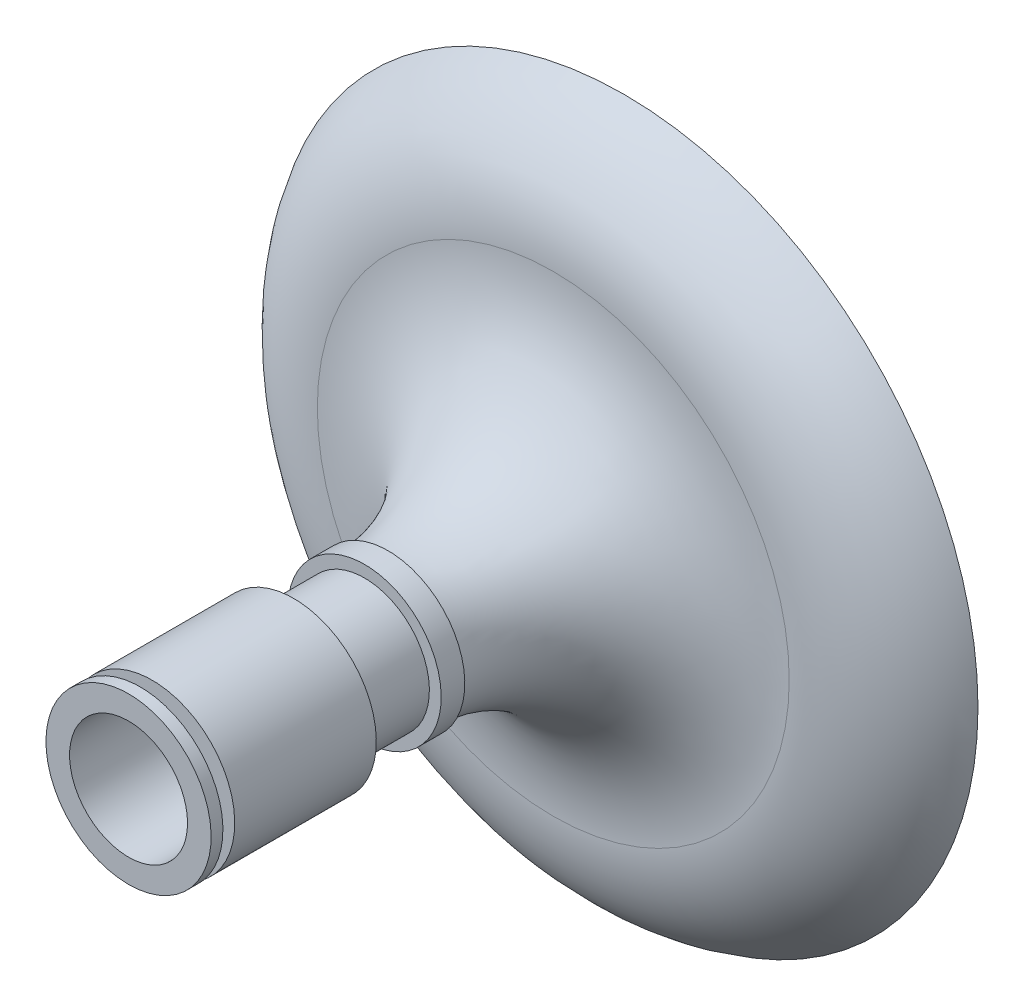
ISO-10303-21;
HEADER;
FILE_DESCRIPTION(('STEP AP214'),'2;1');
FILE_NAME('part.step','',(''),(''),'','','');
FILE_SCHEMA(('AUTOMOTIVE_DESIGN { 1 0 10303 214 1 1 1 1 }'));
ENDSEC;
DATA;
#1=APPLICATION_CONTEXT('core data for automotive mechanical design processes');
#2=APPLICATION_PROTOCOL_DEFINITION('international standard','automotive_design',2000,#1);
#3=PRODUCT_CONTEXT('',#1,'mechanical');
#4=PRODUCT('Part','Part','',(#3));
#5=PRODUCT_RELATED_PRODUCT_CATEGORY('part','',(#4));
#6=PRODUCT_DEFINITION_FORMATION('','',#4);
#7=PRODUCT_DEFINITION_CONTEXT('part definition',#1,'design');
#8=PRODUCT_DEFINITION('design','',#6,#7);
#9=PRODUCT_DEFINITION_SHAPE('','',#8);
#10=(LENGTH_UNIT() NAMED_UNIT(*) SI_UNIT(.MILLI.,.METRE.));
#11=(NAMED_UNIT(*) PLANE_ANGLE_UNIT() SI_UNIT($,.RADIAN.));
#12=(NAMED_UNIT(*) SI_UNIT($,.STERADIAN.) SOLID_ANGLE_UNIT());
#13=UNCERTAINTY_MEASURE_WITH_UNIT(LENGTH_MEASURE(1.E-05),#10,'distance_accuracy_value','');
#14=(GEOMETRIC_REPRESENTATION_CONTEXT(3) GLOBAL_UNCERTAINTY_ASSIGNED_CONTEXT((#13)) GLOBAL_UNIT_ASSIGNED_CONTEXT((#10,
#11,#12)) REPRESENTATION_CONTEXT('',''));
#15=CARTESIAN_POINT('',(0.,0.,0.));
#16=DIRECTION('',(0.,0.,1.));
#17=DIRECTION('',(1.,0.,0.));
#18=AXIS2_PLACEMENT_3D('',#15,#16,#17);
#19=CARTESIAN_POINT('',(0.,0.,0.));
#20=DIRECTION('',(0.,0.,-1.));
#21=DIRECTION('',(0.,1.,0.));
#22=AXIS2_PLACEMENT_3D('',#19,#20,#21);
#23=PLANE('',#22);
#24=CARTESIAN_POINT('',(0.,0.,0.));
#25=DIRECTION('',(0.,0.,-1.));
#26=DIRECTION('',(0.,1.,0.));
#27=AXIS2_PLACEMENT_3D('',#24,#25,#26);
#28=CIRCLE('',#27,2.5);
#29=CARTESIAN_POINT('',(0.,2.5,0.));
#30=VERTEX_POINT('',#29);
#31=EDGE_CURVE('E90',#30,#30,#28,.T.);
#32=ORIENTED_EDGE('',*,*,#31,.F.);
#33=EDGE_LOOP('',(#32));
#34=FACE_BOUND('',#33,.T.);
#35=CARTESIAN_POINT('',(0.,0.,0.));
#36=DIRECTION('',(0.,0.,1.));
#37=DIRECTION('',(0.,-1.,0.));
#38=AXIS2_PLACEMENT_3D('',#35,#36,#37);
#39=CIRCLE('',#38,3.25);
#40=CARTESIAN_POINT('',(0.,-3.25,0.));
#41=VERTEX_POINT('',#40);
#42=EDGE_CURVE('E11',#41,#41,#39,.T.);
#43=ORIENTED_EDGE('',*,*,#42,.F.);
#44=EDGE_LOOP('',(#43));
#45=FACE_BOUND('',#44,.T.);
#46=ADVANCED_FACE('F53',(#34,#45),#23,.T.);
#47=CARTESIAN_POINT('',(0.,0.,11.));
#48=DIRECTION('',(0.,0.,1.));
#49=DIRECTION('',(0.,-1.,0.));
#50=AXIS2_PLACEMENT_3D('',#47,#48,#49);
#51=CYLINDRICAL_SURFACE('',#50,3.25);
#52=ORIENTED_EDGE('',*,*,#42,.T.);
#53=EDGE_LOOP('',(#52));
#54=FACE_BOUND('',#53,.T.);
#55=CARTESIAN_POINT('',(0.,0.,0.999999999999999));
#56=DIRECTION('',(0.,0.,1.));
#57=DIRECTION('',(0.,-1.,0.));
#58=AXIS2_PLACEMENT_3D('',#55,#56,#57);
#59=CIRCLE('',#58,3.25);
#60=CARTESIAN_POINT('',(0.,-3.25,0.999999999999999));
#61=VERTEX_POINT('',#60);
#62=EDGE_CURVE('E59',#61,#61,#59,.T.);
#63=ORIENTED_EDGE('',*,*,#62,.F.);
#64=EDGE_LOOP('',(#63));
#65=FACE_BOUND('',#64,.T.);
#66=ADVANCED_FACE('F117',(#54,#65),#51,.T.);
#67=CARTESIAN_POINT('',(0.,-3.25,0.999999999999999));
#68=DIRECTION('',(0.,0.,1.));
#69=DIRECTION('',(0.,-1.,0.));
#70=AXIS2_PLACEMENT_3D('',#67,#68,#69);
#71=PLANE('',#70);
#72=ORIENTED_EDGE('',*,*,#62,.T.);
#73=EDGE_LOOP('',(#72));
#74=FACE_BOUND('',#73,.T.);
#75=CARTESIAN_POINT('',(0.,0.,0.999999999999999));
#76=DIRECTION('',(0.,0.,1.));
#77=DIRECTION('',(0.,-1.,0.));
#78=AXIS2_PLACEMENT_3D('',#75,#76,#77);
#79=CIRCLE('',#78,2.75);
#80=CARTESIAN_POINT('',(0.,-2.75,0.999999999999999));
#81=VERTEX_POINT('',#80);
#82=EDGE_CURVE('E63',#81,#81,#79,.T.);
#83=ORIENTED_EDGE('',*,*,#82,.F.);
#84=EDGE_LOOP('',(#83));
#85=FACE_BOUND('',#84,.T.);
#86=ADVANCED_FACE('F124',(#74,#85),#71,.T.);
#87=CARTESIAN_POINT('',(0.,0.,11.));
#88=DIRECTION('',(0.,0.,1.));
#89=DIRECTION('',(0.,-1.,0.));
#90=AXIS2_PLACEMENT_3D('',#87,#88,#89);
#91=CYLINDRICAL_SURFACE('',#90,2.75);
#92=ORIENTED_EDGE('',*,*,#82,.T.);
#93=EDGE_LOOP('',(#92));
#94=FACE_BOUND('',#93,.T.);
#95=CARTESIAN_POINT('',(0.,0.,4.));
#96=DIRECTION('',(0.,0.,1.));
#97=DIRECTION('',(0.,-1.,0.));
#98=AXIS2_PLACEMENT_3D('',#95,#96,#97);
#99=CIRCLE('',#98,2.75);
#100=CARTESIAN_POINT('',(0.,-2.75,4.));
#101=VERTEX_POINT('',#100);
#102=EDGE_CURVE('E67',#101,#101,#99,.T.);
#103=ORIENTED_EDGE('',*,*,#102,.F.);
#104=EDGE_LOOP('',(#103));
#105=FACE_BOUND('',#104,.T.);
#106=ADVANCED_FACE('F195',(#94,#105),#91,.T.);
#107=CARTESIAN_POINT('',(0.,-2.75,4.));
#108=DIRECTION('',(0.,0.,-1.));
#109=DIRECTION('',(0.,1.,0.));
#110=AXIS2_PLACEMENT_3D('',#107,#108,#109);
#111=PLANE('',#110);
#112=ORIENTED_EDGE('',*,*,#102,.T.);
#113=EDGE_LOOP('',(#112));
#114=FACE_BOUND('',#113,.T.);
#115=CARTESIAN_POINT('',(0.,0.,4.));
#116=DIRECTION('',(0.,0.,1.));
#117=DIRECTION('',(0.,-1.,0.));
#118=AXIS2_PLACEMENT_3D('',#115,#116,#117);
#119=CIRCLE('',#118,3.5);
#120=CARTESIAN_POINT('',(0.,-3.5,4.));
#121=VERTEX_POINT('',#120);
#122=EDGE_CURVE('E72',#121,#121,#119,.T.);
#123=ORIENTED_EDGE('',*,*,#122,.F.);
#124=EDGE_LOOP('',(#123));
#125=FACE_BOUND('',#124,.T.);
#126=ADVANCED_FACE('F186',(#114,#125),#111,.T.);
#127=CARTESIAN_POINT('',(0.,0.,11.));
#128=DIRECTION('',(0.,0.,1.));
#129=DIRECTION('',(0.,-1.,0.));
#130=AXIS2_PLACEMENT_3D('',#127,#128,#129);
#131=CYLINDRICAL_SURFACE('',#130,3.5);
#132=ORIENTED_EDGE('',*,*,#122,.T.);
#133=EDGE_LOOP('',(#132));
#134=FACE_BOUND('',#133,.T.);
#135=CARTESIAN_POINT('',(0.,0.,10.));
#136=DIRECTION('',(0.,0.,1.));
#137=DIRECTION('',(0.,-1.,0.));
#138=AXIS2_PLACEMENT_3D('',#135,#136,#137);
#139=CIRCLE('',#138,3.5);
#140=CARTESIAN_POINT('',(0.,-3.5,10.));
#141=VERTEX_POINT('',#140);
#142=EDGE_CURVE('E75',#141,#141,#139,.T.);
#143=ORIENTED_EDGE('',*,*,#142,.F.);
#144=EDGE_LOOP('',(#143));
#145=FACE_BOUND('',#144,.T.);
#146=ADVANCED_FACE('F177',(#134,#145),#131,.T.);
#147=CARTESIAN_POINT('',(0.,-3.5,10.));
#148=DIRECTION('',(0.,0.,1.));
#149=DIRECTION('',(0.,-1.,0.));
#150=AXIS2_PLACEMENT_3D('',#147,#148,#149);
#151=PLANE('',#150);
#152=ORIENTED_EDGE('',*,*,#142,.T.);
#153=EDGE_LOOP('',(#152));
#154=FACE_BOUND('',#153,.T.);
#155=CARTESIAN_POINT('',(0.,0.,10.));
#156=DIRECTION('',(0.,0.,1.));
#157=DIRECTION('',(0.,-1.,0.));
#158=AXIS2_PLACEMENT_3D('',#155,#156,#157);
#159=CIRCLE('',#158,2.75);
#160=CARTESIAN_POINT('',(0.,-2.75,10.));
#161=VERTEX_POINT('',#160);
#162=EDGE_CURVE('E78',#161,#161,#159,.T.);
#163=ORIENTED_EDGE('',*,*,#162,.F.);
#164=EDGE_LOOP('',(#163));
#165=FACE_BOUND('',#164,.T.);
#166=ADVANCED_FACE('F168',(#154,#165),#151,.T.);
#167=CARTESIAN_POINT('',(0.,0.,11.));
#168=DIRECTION('',(0.,0.,1.));
#169=DIRECTION('',(0.,-1.,0.));
#170=AXIS2_PLACEMENT_3D('',#167,#168,#169);
#171=CYLINDRICAL_SURFACE('',#170,2.75);
#172=ORIENTED_EDGE('',*,*,#162,.T.);
#173=EDGE_LOOP('',(#172));
#174=FACE_BOUND('',#173,.T.);
#175=CARTESIAN_POINT('',(0.,0.,10.5));
#176=DIRECTION('',(0.,0.,1.));
#177=DIRECTION('',(0.,-1.,0.));
#178=AXIS2_PLACEMENT_3D('',#175,#176,#177);
#179=CIRCLE('',#178,2.75);
#180=CARTESIAN_POINT('',(0.,-2.75,10.5));
#181=VERTEX_POINT('',#180);
#182=EDGE_CURVE('E81',#181,#181,#179,.T.);
#183=ORIENTED_EDGE('',*,*,#182,.F.);
#184=EDGE_LOOP('',(#183));
#185=FACE_BOUND('',#184,.T.);
#186=ADVANCED_FACE('F113',(#174,#185),#171,.T.);
#187=CARTESIAN_POINT('',(0.,-2.75,10.5));
#188=DIRECTION('',(0.,0.,-1.));
#189=DIRECTION('',(0.,1.,0.));
#190=AXIS2_PLACEMENT_3D('',#187,#188,#189);
#191=PLANE('',#190);
#192=ORIENTED_EDGE('',*,*,#182,.T.);
#193=EDGE_LOOP('',(#192));
#194=FACE_BOUND('',#193,.T.);
#195=CARTESIAN_POINT('',(0.,0.,10.5));
#196=DIRECTION('',(0.,0.,1.));
#197=DIRECTION('',(0.,-1.,0.));
#198=AXIS2_PLACEMENT_3D('',#195,#196,#197);
#199=CIRCLE('',#198,3.5);
#200=CARTESIAN_POINT('',(0.,-3.5,10.5));
#201=VERTEX_POINT('',#200);
#202=EDGE_CURVE('E84',#201,#201,#199,.T.);
#203=ORIENTED_EDGE('',*,*,#202,.F.);
#204=EDGE_LOOP('',(#203));
#205=FACE_BOUND('',#204,.T.);
#206=ADVANCED_FACE('F107',(#194,#205),#191,.T.);
#207=CARTESIAN_POINT('',(0.,0.,11.));
#208=DIRECTION('',(0.,0.,1.));
#209=DIRECTION('',(0.,-1.,0.));
#210=AXIS2_PLACEMENT_3D('',#207,#208,#209);
#211=CYLINDRICAL_SURFACE('',#210,3.5);
#212=ORIENTED_EDGE('',*,*,#202,.T.);
#213=EDGE_LOOP('',(#212));
#214=FACE_BOUND('',#213,.T.);
#215=CARTESIAN_POINT('',(0.,0.,11.));
#216=DIRECTION('',(0.,0.,1.));
#217=DIRECTION('',(0.,-1.,0.));
#218=AXIS2_PLACEMENT_3D('',#215,#216,#217);
#219=CIRCLE('',#218,3.5);
#220=CARTESIAN_POINT('',(0.,-3.5,11.));
#221=VERTEX_POINT('',#220);
#222=EDGE_CURVE('E87',#221,#221,#219,.T.);
#223=ORIENTED_EDGE('',*,*,#222,.F.);
#224=EDGE_LOOP('',(#223));
#225=FACE_BOUND('',#224,.T.);
#226=ADVANCED_FACE('F102',(#214,#225),#211,.T.);
#227=CARTESIAN_POINT('',(0.,-3.5,11.));
#228=DIRECTION('',(0.,0.,1.));
#229=DIRECTION('',(0.,-1.,0.));
#230=AXIS2_PLACEMENT_3D('',#227,#228,#229);
#231=PLANE('',#230);
#232=CARTESIAN_POINT('',(0.,0.,11.));
#233=DIRECTION('',(0.,0.,1.));
#234=DIRECTION('',(1.,0.,0.));
#235=AXIS2_PLACEMENT_3D('',#232,#233,#234);
#236=CIRCLE('',#235,2.5);
#237=CARTESIAN_POINT('',(2.5,0.,11.));
#238=VERTEX_POINT('',#237);
#239=EDGE_CURVE('E93',#238,#238,#236,.T.);
#240=ORIENTED_EDGE('',*,*,#239,.F.);
#241=EDGE_LOOP('',(#240));
#242=FACE_BOUND('',#241,.T.);
#243=ORIENTED_EDGE('',*,*,#222,.T.);
#244=EDGE_LOOP('',(#243));
#245=FACE_BOUND('',#244,.T.);
#246=ADVANCED_FACE('F99',(#242,#245),#231,.T.);
#247=CARTESIAN_POINT('',(0.,0.,-10.));
#248=DIRECTION('',(0.,0.,1.));
#249=DIRECTION('',(1.,0.,0.));
#250=AXIS2_PLACEMENT_3D('',#247,#248,#249);
#251=CYLINDRICAL_SURFACE('',#250,2.5);
#252=ORIENTED_EDGE('',*,*,#31,.T.);
#253=EDGE_LOOP('',(#252));
#254=FACE_BOUND('',#253,.T.);
#255=ORIENTED_EDGE('',*,*,#239,.T.);
#256=EDGE_LOOP('',(#255));
#257=FACE_BOUND('',#256,.T.);
#258=ADVANCED_FACE('F97',(#254,#257),#251,.F.);
#259=CLOSED_SHELL('',(#46,#66,#86,#106,#126,#146,#166,#186,#206,#226,#246,#258));
#260=MANIFOLD_SOLID_BREP('B2',#259);
#261=CARTESIAN_POINT('',(0.,0.,0.));
#262=DIRECTION('',(0.,0.,1.));
#263=DIRECTION('',(0.,-1.,0.));
#264=AXIS2_PLACEMENT_3D('',#261,#262,#263);
#265=PLANE('',#264);
#266=CARTESIAN_POINT('',(0.,0.,0.));
#267=DIRECTION('',(0.,0.,1.));
#268=DIRECTION('',(0.,-1.,0.));
#269=AXIS2_PLACEMENT_3D('',#266,#267,#268);
#270=CIRCLE('',#269,2.5);
#271=CARTESIAN_POINT('',(0.,-2.5,0.));
#272=VERTEX_POINT('',#271);
#273=EDGE_CURVE('E289',#272,#272,#270,.T.);
#274=ORIENTED_EDGE('',*,*,#273,.F.);
#275=EDGE_LOOP('',(#274));
#276=FACE_BOUND('',#275,.T.);
#277=CARTESIAN_POINT('',(0.,0.,0.));
#278=DIRECTION('',(0.,0.,1.));
#279=DIRECTION('',(0.,-1.,0.));
#280=AXIS2_PLACEMENT_3D('',#277,#278,#279);
#281=CIRCLE('',#280,3.);
#282=CARTESIAN_POINT('',(0.,-3.,0.));
#283=VERTEX_POINT('',#282);
#284=EDGE_CURVE('E52',#283,#283,#281,.T.);
#285=ORIENTED_EDGE('',*,*,#284,.T.);
#286=EDGE_LOOP('',(#285));
#287=FACE_BOUND('',#286,.T.);
#288=ADVANCED_FACE('F269',(#276,#287),#265,.T.);
#289=CARTESIAN_POINT('',(0.,0.,0.));
#290=DIRECTION('',(0.,0.,1.));
#291=DIRECTION('',(0.,-1.,0.));
#292=AXIS2_PLACEMENT_3D('',#289,#290,#291);
#293=TOROIDAL_SURFACE('',#292,10.,7.);
#294=CARTESIAN_POINT('',(0.,0.,-7.));
#295=DIRECTION('',(0.,0.,1.));
#296=DIRECTION('',(0.,-1.,0.));
#297=AXIS2_PLACEMENT_3D('',#294,#295,#296);
#298=CIRCLE('',#297,10.);
#299=CARTESIAN_POINT('',(0.,-10.,-7.));
#300=VERTEX_POINT('',#299);
#301=EDGE_CURVE('E276',#300,#300,#298,.T.);
#302=ORIENTED_EDGE('',*,*,#301,.T.);
#303=EDGE_LOOP('',(#302));
#304=FACE_BOUND('',#303,.T.);
#305=ORIENTED_EDGE('',*,*,#284,.F.);
#306=EDGE_LOOP('',(#305));
#307=FACE_BOUND('',#306,.T.);
#308=ADVANCED_FACE('F313',(#304,#307),#293,.F.);
#309=CARTESIAN_POINT('',(0.,0.,-12.6666666666667));
#310=DIRECTION('',(0.,0.,1.));
#311=DIRECTION('',(0.,-1.,0.));
#312=AXIS2_PLACEMENT_3D('',#309,#310,#311);
#313=TOROIDAL_SURFACE('',#312,10.,5.66666666666666);
#314=CARTESIAN_POINT('',(0.,0.,-9.99999999999999));
#315=DIRECTION('',(0.,0.,1.));
#316=DIRECTION('',(0.,-1.,0.));
#317=AXIS2_PLACEMENT_3D('',#314,#315,#316);
#318=CIRCLE('',#317,15.);
#319=CARTESIAN_POINT('',(0.,-15.,-10.));
#320=VERTEX_POINT('',#319);
#321=EDGE_CURVE('E280',#320,#320,#318,.T.);
#322=ORIENTED_EDGE('',*,*,#321,.T.);
#323=EDGE_LOOP('',(#322));
#324=FACE_BOUND('',#323,.T.);
#325=ORIENTED_EDGE('',*,*,#301,.F.);
#326=EDGE_LOOP('',(#325));
#327=FACE_BOUND('',#326,.T.);
#328=ADVANCED_FACE('F318',(#324,#327),#313,.T.);
#329=CARTESIAN_POINT('',(0.,0.,-10.));
#330=DIRECTION('',(0.,0.,-1.));
#331=DIRECTION('',(0.,1.,0.));
#332=AXIS2_PLACEMENT_3D('',#329,#330,#331);
#333=PLANE('',#332);
#334=CARTESIAN_POINT('',(0.,0.,-10.));
#335=DIRECTION('',(0.,0.,-1.));
#336=DIRECTION('',(0.,1.,0.));
#337=AXIS2_PLACEMENT_3D('',#334,#335,#336);
#338=CIRCLE('',#337,13.8297084310254);
#339=CARTESIAN_POINT('',(0.,13.8297084310254,-9.99999999999999));
#340=VERTEX_POINT('',#339);
#341=EDGE_CURVE('E286',#340,#340,#338,.F.);
#342=ORIENTED_EDGE('',*,*,#341,.T.);
#343=EDGE_LOOP('',(#342));
#344=FACE_BOUND('',#343,.T.);
#345=ORIENTED_EDGE('',*,*,#321,.F.);
#346=EDGE_LOOP('',(#345));
#347=FACE_BOUND('',#346,.T.);
#348=ADVANCED_FACE('F323',(#344,#347),#333,.T.);
#349=CARTESIAN_POINT('',(0.,0.,0.));
#350=DIRECTION('',(0.,0.,1.));
#351=DIRECTION('',(0.,-1.,0.));
#352=AXIS2_PLACEMENT_3D('',#349,#350,#351);
#353=TOROIDAL_SURFACE('',#352,10.,8.);
#354=CARTESIAN_POINT('',(0.,0.,-2.78388218141501));
#355=DIRECTION('',(0.,0.,1.));
#356=DIRECTION('',(0.,-1.,0.));
#357=AXIS2_PLACEMENT_3D('',#354,#355,#356);
#358=CIRCLE('',#357,2.5);
#359=CARTESIAN_POINT('',(0.,-2.5,-2.78388218141501));
#360=VERTEX_POINT('',#359);
#361=EDGE_CURVE('E272',#360,#360,#358,.T.);
#362=ORIENTED_EDGE('',*,*,#361,.T.);
#363=EDGE_LOOP('',(#362));
#364=FACE_BOUND('',#363,.T.);
#365=CARTESIAN_POINT('',(0.,0.,-8.));
#366=DIRECTION('',(0.,0.,1.));
#367=DIRECTION('',(0.,-1.,0.));
#368=AXIS2_PLACEMENT_3D('',#365,#366,#367);
#369=CIRCLE('',#368,10.);
#370=CARTESIAN_POINT('',(0.,-10.,-8.));
#371=VERTEX_POINT('',#370);
#372=EDGE_CURVE('E285',#371,#371,#369,.T.);
#373=ORIENTED_EDGE('',*,*,#372,.F.);
#374=EDGE_LOOP('',(#373));
#375=FACE_BOUND('',#374,.T.);
#376=ADVANCED_FACE('F298',(#364,#375),#353,.T.);
#377=CARTESIAN_POINT('',(0.,0.,-12.6666666666667));
#378=DIRECTION('',(0.,0.,1.));
#379=DIRECTION('',(0.,-1.,0.));
#380=AXIS2_PLACEMENT_3D('',#377,#378,#379);
#381=TOROIDAL_SURFACE('',#380,10.,4.66666666666666);
#382=ORIENTED_EDGE('',*,*,#341,.F.);
#383=EDGE_LOOP('',(#382));
#384=FACE_BOUND('',#383,.T.);
#385=ORIENTED_EDGE('',*,*,#372,.T.);
#386=EDGE_LOOP('',(#385));
#387=FACE_BOUND('',#386,.T.);
#388=ADVANCED_FACE('F303',(#384,#387),#381,.F.);
#389=CARTESIAN_POINT('',(0.,0.,-10.));
#390=DIRECTION('',(0.,0.,1.));
#391=DIRECTION('',(1.,0.,0.));
#392=AXIS2_PLACEMENT_3D('',#389,#390,#391);
#393=CYLINDRICAL_SURFACE('',#392,2.5);
#394=ORIENTED_EDGE('',*,*,#273,.T.);
#395=EDGE_LOOP('',(#394));
#396=FACE_BOUND('',#395,.T.);
#397=ORIENTED_EDGE('',*,*,#361,.F.);
#398=EDGE_LOOP('',(#397));
#399=FACE_BOUND('',#398,.T.);
#400=ADVANCED_FACE('F301',(#396,#399),#393,.F.);
#401=CLOSED_SHELL('',(#288,#308,#328,#348,#376,#388,#400));
#402=MANIFOLD_SOLID_BREP('B6',#401);
#403=ADVANCED_BREP_SHAPE_REPRESENTATION('',(#18,#260,#402),#14);
#404=SHAPE_DEFINITION_REPRESENTATION(#9,#403);
ENDSEC;
END-ISO-10303-21;
